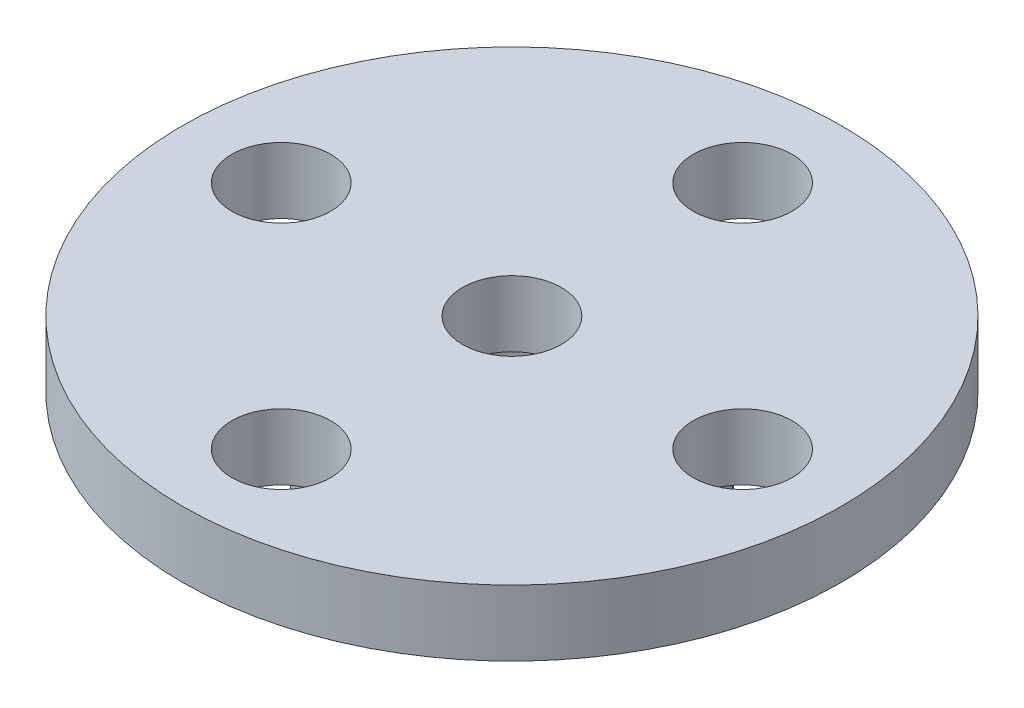
ISO-10303-21;
HEADER;
FILE_DESCRIPTION(('STEP AP214'),'2;1');
FILE_NAME('part.step','',(''),(''),'','','');
FILE_SCHEMA(('AUTOMOTIVE_DESIGN { 1 0 10303 214 1 1 1 1 }'));
ENDSEC;
DATA;
#1=APPLICATION_CONTEXT('core data for automotive mechanical design processes');
#2=APPLICATION_PROTOCOL_DEFINITION('international standard','automotive_design',2000,#1);
#3=PRODUCT_CONTEXT('',#1,'mechanical');
#4=PRODUCT('Part','Part','',(#3));
#5=PRODUCT_RELATED_PRODUCT_CATEGORY('part','',(#4));
#6=PRODUCT_DEFINITION_FORMATION('','',#4);
#7=PRODUCT_DEFINITION_CONTEXT('part definition',#1,'design');
#8=PRODUCT_DEFINITION('design','',#6,#7);
#9=PRODUCT_DEFINITION_SHAPE('','',#8);
#10=(LENGTH_UNIT() NAMED_UNIT(*) SI_UNIT(.MILLI.,.METRE.));
#11=(NAMED_UNIT(*) PLANE_ANGLE_UNIT() SI_UNIT($,.RADIAN.));
#12=(NAMED_UNIT(*) SI_UNIT($,.STERADIAN.) SOLID_ANGLE_UNIT());
#13=UNCERTAINTY_MEASURE_WITH_UNIT(LENGTH_MEASURE(1.E-05),#10,'distance_accuracy_value','');
#14=(GEOMETRIC_REPRESENTATION_CONTEXT(3) GLOBAL_UNCERTAINTY_ASSIGNED_CONTEXT((#13)) GLOBAL_UNIT_ASSIGNED_CONTEXT((#10,
#11,#12)) REPRESENTATION_CONTEXT('',''));
#15=CARTESIAN_POINT('',(0.,0.,0.));
#16=DIRECTION('',(0.,0.,1.));
#17=DIRECTION('',(1.,0.,0.));
#18=AXIS2_PLACEMENT_3D('',#15,#16,#17);
#19=CARTESIAN_POINT('',(0.,0.,0.));
#20=DIRECTION('',(0.,1.,0.));
#21=DIRECTION('',(0.,0.,1.));
#22=AXIS2_PLACEMENT_3D('',#19,#20,#21);
#23=PLANE('',#22);
#24=CARTESIAN_POINT('',(0.,0.,0.));
#25=DIRECTION('',(0.,1.,0.));
#26=DIRECTION('',(0.,0.,1.));
#27=AXIS2_PLACEMENT_3D('',#24,#25,#26);
#28=CIRCLE('',#27,1.5);
#29=CARTESIAN_POINT('',(0.,0.,1.5));
#30=VERTEX_POINT('',#29);
#31=EDGE_CURVE('E80',#30,#30,#28,.T.);
#32=ORIENTED_EDGE('',*,*,#31,.T.);
#33=EDGE_LOOP('',(#32));
#34=FACE_BOUND('',#33,.T.);
#35=CARTESIAN_POINT('',(0.,0.,0.));
#36=DIRECTION('',(0.,1.,0.));
#37=DIRECTION('',(0.,0.,1.));
#38=AXIS2_PLACEMENT_3D('',#35,#36,#37);
#39=CIRCLE('',#38,2.9);
#40=CARTESIAN_POINT('',(0.,0.,2.9));
#41=VERTEX_POINT('',#40);
#42=EDGE_CURVE('E10',#41,#41,#39,.T.);
#43=ORIENTED_EDGE('',*,*,#42,.F.);
#44=EDGE_LOOP('',(#43));
#45=FACE_BOUND('',#44,.T.);
#46=ADVANCED_FACE('F37',(#34,#45),#23,.F.);
#47=CARTESIAN_POINT('',(0.,2.,0.));
#48=DIRECTION('',(0.,-1.,0.));
#49=DIRECTION('',(0.,0.,-1.));
#50=AXIS2_PLACEMENT_3D('',#47,#48,#49);
#51=CYLINDRICAL_SURFACE('',#50,10.);
#52=CARTESIAN_POINT('',(0.,2.,0.));
#53=DIRECTION('',(0.,1.,0.));
#54=DIRECTION('',(0.,0.,1.));
#55=AXIS2_PLACEMENT_3D('',#52,#53,#54);
#56=CIRCLE('',#55,10.);
#57=CARTESIAN_POINT('',(0.,2.,10.));
#58=VERTEX_POINT('',#57);
#59=EDGE_CURVE('E50',#58,#58,#56,.T.);
#60=ORIENTED_EDGE('',*,*,#59,.F.);
#61=EDGE_LOOP('',(#60));
#62=FACE_BOUND('',#61,.T.);
#63=CARTESIAN_POINT('',(0.,0.,0.));
#64=DIRECTION('',(0.,1.,0.));
#65=DIRECTION('',(0.,0.,1.));
#66=AXIS2_PLACEMENT_3D('',#63,#64,#65);
#67=CIRCLE('',#66,10.);
#68=CARTESIAN_POINT('',(0.,0.,10.));
#69=VERTEX_POINT('',#68);
#70=EDGE_CURVE('E77',#69,#69,#67,.T.);
#71=ORIENTED_EDGE('',*,*,#70,.T.);
#72=EDGE_LOOP('',(#71));
#73=FACE_BOUND('',#72,.T.);
#74=ADVANCED_FACE('F119',(#62,#73),#51,.T.);
#75=CARTESIAN_POINT('',(0.,2.,7.));
#76=DIRECTION('',(0.,-1.,0.));
#77=DIRECTION('',(0.,0.,-1.));
#78=AXIS2_PLACEMENT_3D('',#75,#76,#77);
#79=CYLINDRICAL_SURFACE('',#78,1.5);
#80=CARTESIAN_POINT('',(0.,2.,7.));
#81=DIRECTION('',(0.,1.,0.));
#82=DIRECTION('',(0.,0.,1.));
#83=AXIS2_PLACEMENT_3D('',#80,#81,#82);
#84=CIRCLE('',#83,1.5);
#85=CARTESIAN_POINT('',(0.,2.,8.5));
#86=VERTEX_POINT('',#85);
#87=EDGE_CURVE('E56',#86,#86,#84,.T.);
#88=ORIENTED_EDGE('',*,*,#87,.T.);
#89=EDGE_LOOP('',(#88));
#90=FACE_BOUND('',#89,.T.);
#91=CARTESIAN_POINT('',(0.,0.,7.));
#92=DIRECTION('',(0.,1.,0.));
#93=DIRECTION('',(0.,0.,1.));
#94=AXIS2_PLACEMENT_3D('',#91,#92,#93);
#95=CIRCLE('',#94,1.5);
#96=CARTESIAN_POINT('',(0.,0.,8.5));
#97=VERTEX_POINT('',#96);
#98=EDGE_CURVE('E73',#97,#97,#95,.T.);
#99=ORIENTED_EDGE('',*,*,#98,.F.);
#100=EDGE_LOOP('',(#99));
#101=FACE_BOUND('',#100,.T.);
#102=ADVANCED_FACE('F106',(#90,#101),#79,.F.);
#103=CARTESIAN_POINT('',(-7.,2.,0.));
#104=DIRECTION('',(0.,-1.,0.));
#105=DIRECTION('',(0.,0.,-1.));
#106=AXIS2_PLACEMENT_3D('',#103,#104,#105);
#107=CYLINDRICAL_SURFACE('',#106,1.5);
#108=CARTESIAN_POINT('',(-7.,2.,0.));
#109=DIRECTION('',(0.,1.,0.));
#110=DIRECTION('',(0.,0.,1.));
#111=AXIS2_PLACEMENT_3D('',#108,#109,#110);
#112=CIRCLE('',#111,1.5);
#113=CARTESIAN_POINT('',(-7.,2.,1.49999999999998));
#114=VERTEX_POINT('',#113);
#115=EDGE_CURVE('E94',#114,#114,#112,.T.);
#116=ORIENTED_EDGE('',*,*,#115,.T.);
#117=EDGE_LOOP('',(#116));
#118=FACE_BOUND('',#117,.T.);
#119=CARTESIAN_POINT('',(-7.,0.,0.));
#120=DIRECTION('',(0.,1.,0.));
#121=DIRECTION('',(0.,0.,1.));
#122=AXIS2_PLACEMENT_3D('',#119,#120,#121);
#123=CIRCLE('',#122,1.5);
#124=CARTESIAN_POINT('',(-7.,0.,1.49999999999998));
#125=VERTEX_POINT('',#124);
#126=EDGE_CURVE('E69',#125,#125,#123,.T.);
#127=ORIENTED_EDGE('',*,*,#126,.F.);
#128=EDGE_LOOP('',(#127));
#129=FACE_BOUND('',#128,.T.);
#130=ADVANCED_FACE('F153',(#118,#129),#107,.F.);
#131=CARTESIAN_POINT('',(0.,2.,-7.));
#132=DIRECTION('',(0.,-1.,0.));
#133=DIRECTION('',(0.,0.,-1.));
#134=AXIS2_PLACEMENT_3D('',#131,#132,#133);
#135=CYLINDRICAL_SURFACE('',#134,1.5);
#136=CARTESIAN_POINT('',(0.,2.,-7.));
#137=DIRECTION('',(0.,1.,0.));
#138=DIRECTION('',(0.,0.,1.));
#139=AXIS2_PLACEMENT_3D('',#136,#137,#138);
#140=CIRCLE('',#139,1.5);
#141=CARTESIAN_POINT('',(0.,2.,-5.5));
#142=VERTEX_POINT('',#141);
#143=EDGE_CURVE('E88',#142,#142,#140,.T.);
#144=ORIENTED_EDGE('',*,*,#143,.T.);
#145=EDGE_LOOP('',(#144));
#146=FACE_BOUND('',#145,.T.);
#147=CARTESIAN_POINT('',(0.,0.,-7.));
#148=DIRECTION('',(0.,1.,0.));
#149=DIRECTION('',(0.,0.,1.));
#150=AXIS2_PLACEMENT_3D('',#147,#148,#149);
#151=CIRCLE('',#150,1.5);
#152=CARTESIAN_POINT('',(0.,0.,-5.5));
#153=VERTEX_POINT('',#152);
#154=EDGE_CURVE('E64',#153,#153,#151,.T.);
#155=ORIENTED_EDGE('',*,*,#154,.F.);
#156=EDGE_LOOP('',(#155));
#157=FACE_BOUND('',#156,.T.);
#158=ADVANCED_FACE('F160',(#146,#157),#135,.F.);
#159=CARTESIAN_POINT('',(7.,2.,0.));
#160=DIRECTION('',(0.,-1.,0.));
#161=DIRECTION('',(0.,0.,-1.));
#162=AXIS2_PLACEMENT_3D('',#159,#160,#161);
#163=CYLINDRICAL_SURFACE('',#162,1.5);
#164=CARTESIAN_POINT('',(7.,2.,0.));
#165=DIRECTION('',(0.,1.,0.));
#166=DIRECTION('',(0.,0.,1.));
#167=AXIS2_PLACEMENT_3D('',#164,#165,#166);
#168=CIRCLE('',#167,1.5);
#169=CARTESIAN_POINT('',(7.,2.,1.50000000000007));
#170=VERTEX_POINT('',#169);
#171=EDGE_CURVE('E83',#170,#170,#168,.T.);
#172=ORIENTED_EDGE('',*,*,#171,.T.);
#173=EDGE_LOOP('',(#172));
#174=FACE_BOUND('',#173,.T.);
#175=CARTESIAN_POINT('',(7.,0.,0.));
#176=DIRECTION('',(0.,1.,0.));
#177=DIRECTION('',(0.,0.,1.));
#178=AXIS2_PLACEMENT_3D('',#175,#176,#177);
#179=CIRCLE('',#178,1.5);
#180=CARTESIAN_POINT('',(7.,0.,1.50000000000007));
#181=VERTEX_POINT('',#180);
#182=EDGE_CURVE('E60',#181,#181,#179,.T.);
#183=ORIENTED_EDGE('',*,*,#182,.F.);
#184=EDGE_LOOP('',(#183));
#185=FACE_BOUND('',#184,.T.);
#186=ADVANCED_FACE('F39',(#174,#185),#163,.F.);
#187=CARTESIAN_POINT('',(0.,2.,0.));
#188=DIRECTION('',(0.,-1.,0.));
#189=DIRECTION('',(0.,0.,-1.));
#190=AXIS2_PLACEMENT_3D('',#187,#188,#189);
#191=CYLINDRICAL_SURFACE('',#190,1.5);
#192=CARTESIAN_POINT('',(0.,2.,0.));
#193=DIRECTION('',(0.,1.,0.));
#194=DIRECTION('',(0.,0.,1.));
#195=AXIS2_PLACEMENT_3D('',#192,#193,#194);
#196=CIRCLE('',#195,1.5);
#197=CARTESIAN_POINT('',(0.,2.,1.5));
#198=VERTEX_POINT('',#197);
#199=EDGE_CURVE('E45',#198,#198,#196,.T.);
#200=ORIENTED_EDGE('',*,*,#199,.T.);
#201=EDGE_LOOP('',(#200));
#202=FACE_BOUND('',#201,.T.);
#203=ORIENTED_EDGE('',*,*,#31,.F.);
#204=EDGE_LOOP('',(#203));
#205=FACE_BOUND('',#204,.T.);
#206=ADVANCED_FACE('F113',(#202,#205),#191,.F.);
#207=CARTESIAN_POINT('',(0.,2.,0.));
#208=DIRECTION('',(0.,1.,0.));
#209=DIRECTION('',(0.,0.,1.));
#210=AXIS2_PLACEMENT_3D('',#207,#208,#209);
#211=PLANE('',#210);
#212=ORIENTED_EDGE('',*,*,#171,.F.);
#213=EDGE_LOOP('',(#212));
#214=FACE_BOUND('',#213,.T.);
#215=ORIENTED_EDGE('',*,*,#143,.F.);
#216=EDGE_LOOP('',(#215));
#217=FACE_BOUND('',#216,.T.);
#218=ORIENTED_EDGE('',*,*,#115,.F.);
#219=EDGE_LOOP('',(#218));
#220=FACE_BOUND('',#219,.T.);
#221=ORIENTED_EDGE('',*,*,#87,.F.);
#222=EDGE_LOOP('',(#221));
#223=FACE_BOUND('',#222,.T.);
#224=ORIENTED_EDGE('',*,*,#59,.T.);
#225=EDGE_LOOP('',(#224));
#226=FACE_BOUND('',#225,.T.);
#227=ORIENTED_EDGE('',*,*,#199,.F.);
#228=EDGE_LOOP('',(#227));
#229=FACE_BOUND('',#228,.T.);
#230=ADVANCED_FACE('F109',(#214,#217,#220,#223,#226,#229),#211,.T.);
#231=CARTESIAN_POINT('',(0.,0.,0.));
#232=DIRECTION('',(0.,1.,0.));
#233=DIRECTION('',(0.,0.,1.));
#234=AXIS2_PLACEMENT_3D('',#231,#232,#233);
#235=CIRCLE('',#234,4.75);
#236=CARTESIAN_POINT('',(0.,0.,4.75));
#237=VERTEX_POINT('',#236);
#238=EDGE_CURVE('E97',#237,#237,#235,.T.);
#239=ORIENTED_EDGE('',*,*,#238,.T.);
#240=EDGE_LOOP('',(#239));
#241=FACE_BOUND('',#240,.T.);
#242=ORIENTED_EDGE('',*,*,#182,.T.);
#243=EDGE_LOOP('',(#242));
#244=FACE_BOUND('',#243,.T.);
#245=ORIENTED_EDGE('',*,*,#154,.T.);
#246=EDGE_LOOP('',(#245));
#247=FACE_BOUND('',#246,.T.);
#248=ORIENTED_EDGE('',*,*,#126,.T.);
#249=EDGE_LOOP('',(#248));
#250=FACE_BOUND('',#249,.T.);
#251=ORIENTED_EDGE('',*,*,#98,.T.);
#252=EDGE_LOOP('',(#251));
#253=FACE_BOUND('',#252,.T.);
#254=ORIENTED_EDGE('',*,*,#70,.F.);
#255=EDGE_LOOP('',(#254));
#256=FACE_BOUND('',#255,.T.);
#257=ADVANCED_FACE('F112',(#241,#244,#247,#250,#253,#256),#23,.F.);
#258=CARTESIAN_POINT('',(0.,-3.,0.));
#259=DIRECTION('',(0.,1.,0.));
#260=DIRECTION('',(0.,0.,1.));
#261=AXIS2_PLACEMENT_3D('',#258,#259,#260);
#262=CYLINDRICAL_SURFACE('',#261,2.9);
#263=CARTESIAN_POINT('',(0.,-3.,0.));
#264=DIRECTION('',(0.,1.,0.));
#265=DIRECTION('',(0.,0.,1.));
#266=AXIS2_PLACEMENT_3D('',#263,#264,#265);
#267=CIRCLE('',#266,2.9);
#268=CARTESIAN_POINT('',(0.,-3.,2.9));
#269=VERTEX_POINT('',#268);
#270=EDGE_CURVE('E228',#269,#269,#267,.T.);
#271=ORIENTED_EDGE('',*,*,#270,.F.);
#272=EDGE_LOOP('',(#271));
#273=FACE_BOUND('',#272,.T.);
#274=ORIENTED_EDGE('',*,*,#42,.T.);
#275=EDGE_LOOP('',(#274));
#276=FACE_BOUND('',#275,.T.);
#277=ADVANCED_FACE('F126',(#273,#276),#262,.F.);
#278=CARTESIAN_POINT('',(0.,-3.,0.));
#279=DIRECTION('',(0.,1.,0.));
#280=DIRECTION('',(0.,0.,1.));
#281=AXIS2_PLACEMENT_3D('',#278,#279,#280);
#282=CYLINDRICAL_SURFACE('',#281,4.75);
#283=CARTESIAN_POINT('',(0.,-3.,0.));
#284=DIRECTION('',(0.,1.,0.));
#285=DIRECTION('',(0.,0.,1.));
#286=AXIS2_PLACEMENT_3D('',#283,#284,#285);
#287=CIRCLE('',#286,4.75);
#288=CARTESIAN_POINT('',(0.,-3.,4.75));
#289=VERTEX_POINT('',#288);
#290=EDGE_CURVE('E65',#289,#289,#287,.T.);
#291=ORIENTED_EDGE('',*,*,#290,.T.);
#292=EDGE_LOOP('',(#291));
#293=FACE_BOUND('',#292,.T.);
#294=ORIENTED_EDGE('',*,*,#238,.F.);
#295=EDGE_LOOP('',(#294));
#296=FACE_BOUND('',#295,.T.);
#297=ADVANCED_FACE('F132',(#293,#296),#282,.T.);
#298=CARTESIAN_POINT('',(0.,-3.,0.));
#299=DIRECTION('',(0.,1.,0.));
#300=DIRECTION('',(0.,0.,1.));
#301=AXIS2_PLACEMENT_3D('',#298,#299,#300);
#302=PLANE('',#301);
#303=ORIENTED_EDGE('',*,*,#270,.T.);
#304=EDGE_LOOP('',(#303));
#305=FACE_BOUND('',#304,.T.);
#306=ORIENTED_EDGE('',*,*,#290,.F.);
#307=EDGE_LOOP('',(#306));
#308=FACE_BOUND('',#307,.T.);
#309=ADVANCED_FACE('F211',(#305,#308),#302,.F.);
#310=CLOSED_SHELL('',(#46,#74,#102,#130,#158,#186,#206,#230,#257,#277,#297,#309));
#311=MANIFOLD_SOLID_BREP('B2',#310);
#312=ADVANCED_BREP_SHAPE_REPRESENTATION('',(#18,#311),#14);
#313=SHAPE_DEFINITION_REPRESENTATION(#9,#312);
ENDSEC;
END-ISO-10303-21;
